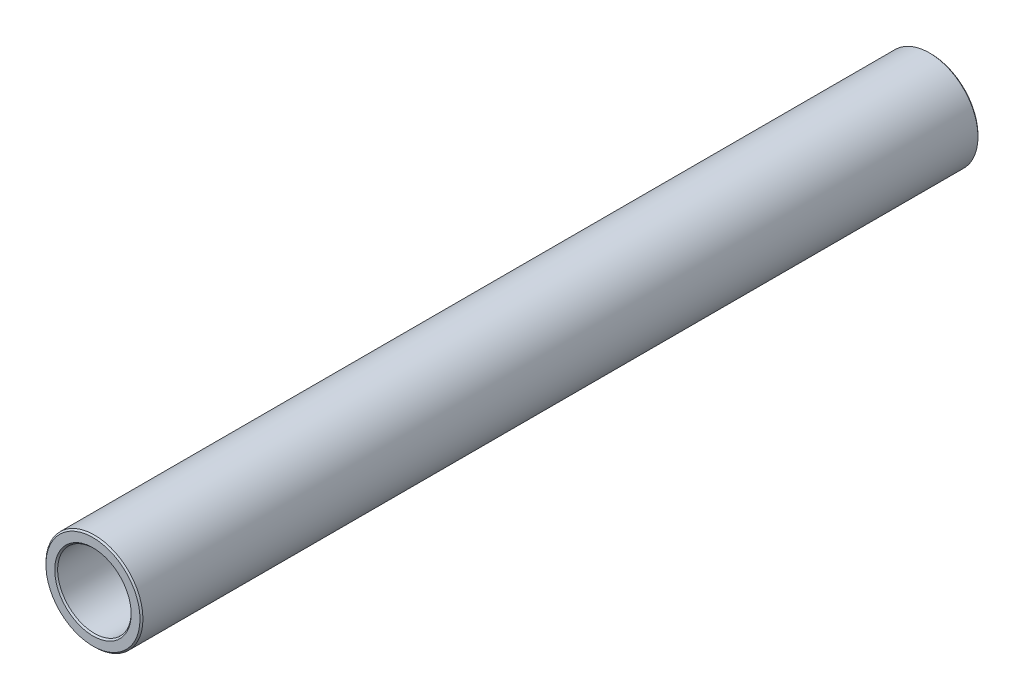
ISO-10303-21;
HEADER;
FILE_DESCRIPTION(('STEP AP214'),'2;1');
FILE_NAME('part.step','',(''),(''),'','','');
FILE_SCHEMA(('AUTOMOTIVE_DESIGN { 1 0 10303 214 1 1 1 1 }'));
ENDSEC;
DATA;
#1=APPLICATION_CONTEXT('core data for automotive mechanical design processes');
#2=APPLICATION_PROTOCOL_DEFINITION('international standard','automotive_design',2000,#1);
#3=PRODUCT_CONTEXT('',#1,'mechanical');
#4=PRODUCT('Part','Part','',(#3));
#5=PRODUCT_RELATED_PRODUCT_CATEGORY('part','',(#4));
#6=PRODUCT_DEFINITION_FORMATION('','',#4);
#7=PRODUCT_DEFINITION_CONTEXT('part definition',#1,'design');
#8=PRODUCT_DEFINITION('design','',#6,#7);
#9=PRODUCT_DEFINITION_SHAPE('','',#8);
#10=(LENGTH_UNIT() NAMED_UNIT(*) SI_UNIT(.MILLI.,.METRE.));
#11=(NAMED_UNIT(*) PLANE_ANGLE_UNIT() SI_UNIT($,.RADIAN.));
#12=(NAMED_UNIT(*) SI_UNIT($,.STERADIAN.) SOLID_ANGLE_UNIT());
#13=UNCERTAINTY_MEASURE_WITH_UNIT(LENGTH_MEASURE(1.E-05),#10,'distance_accuracy_value','');
#14=(GEOMETRIC_REPRESENTATION_CONTEXT(3) GLOBAL_UNCERTAINTY_ASSIGNED_CONTEXT((#13)) GLOBAL_UNIT_ASSIGNED_CONTEXT((#10,
#11,#12)) REPRESENTATION_CONTEXT('',''));
#15=CARTESIAN_POINT('',(0.,0.,0.));
#16=DIRECTION('',(0.,0.,1.));
#17=DIRECTION('',(1.,0.,0.));
#18=AXIS2_PLACEMENT_3D('',#15,#16,#17);
#19=CARTESIAN_POINT('',(0.,0.,285.));
#20=DIRECTION('',(0.,0.,1.));
#21=DIRECTION('',(1.,0.,0.));
#22=AXIS2_PLACEMENT_3D('',#19,#20,#21);
#23=PLANE('',#22);
#24=CARTESIAN_POINT('',(0.,0.,285.));
#25=DIRECTION('',(0.,0.,1.));
#26=DIRECTION('',(1.,0.,0.));
#27=AXIS2_PLACEMENT_3D('',#24,#25,#26);
#28=CIRCLE('',#27,26.);
#29=CARTESIAN_POINT('',(26.,0.,285.));
#30=VERTEX_POINT('',#29);
#31=EDGE_CURVE('E52',#30,#30,#28,.F.);
#32=ORIENTED_EDGE('',*,*,#31,.T.);
#33=EDGE_LOOP('',(#32));
#34=FACE_BOUND('',#33,.T.);
#35=CARTESIAN_POINT('',(0.,0.,285.));
#36=DIRECTION('',(0.,0.,1.));
#37=DIRECTION('',(1.,0.,0.));
#38=AXIS2_PLACEMENT_3D('',#35,#36,#37);
#39=CIRCLE('',#38,31.9999999999999);
#40=CARTESIAN_POINT('',(31.9999999999999,0.,285.));
#41=VERTEX_POINT('',#40);
#42=EDGE_CURVE('E55',#41,#41,#39,.T.);
#43=ORIENTED_EDGE('',*,*,#42,.T.);
#44=EDGE_LOOP('',(#43));
#45=FACE_BOUND('',#44,.T.);
#46=ADVANCED_FACE('F32',(#34,#45),#23,.T.);
#47=CARTESIAN_POINT('',(0.,0.,-285.));
#48=DIRECTION('',(0.,0.,1.));
#49=DIRECTION('',(1.,0.,0.));
#50=AXIS2_PLACEMENT_3D('',#47,#48,#49);
#51=PLANE('',#50);
#52=CARTESIAN_POINT('',(0.,0.,-285.));
#53=DIRECTION('',(0.,0.,1.));
#54=DIRECTION('',(1.,0.,0.));
#55=AXIS2_PLACEMENT_3D('',#52,#53,#54);
#56=CIRCLE('',#55,26.0000000000001);
#57=CARTESIAN_POINT('',(26.0000000000001,0.,-285.));
#58=VERTEX_POINT('',#57);
#59=EDGE_CURVE('E10',#58,#58,#56,.T.);
#60=ORIENTED_EDGE('',*,*,#59,.T.);
#61=EDGE_LOOP('',(#60));
#62=FACE_BOUND('',#61,.T.);
#63=CARTESIAN_POINT('',(0.,0.,-285.));
#64=DIRECTION('',(0.,0.,1.));
#65=DIRECTION('',(1.,0.,0.));
#66=AXIS2_PLACEMENT_3D('',#63,#64,#65);
#67=CIRCLE('',#66,32.);
#68=CARTESIAN_POINT('',(32.,0.,-285.));
#69=VERTEX_POINT('',#68);
#70=EDGE_CURVE('E39',#69,#69,#67,.F.);
#71=ORIENTED_EDGE('',*,*,#70,.T.);
#72=EDGE_LOOP('',(#71));
#73=FACE_BOUND('',#72,.T.);
#74=ADVANCED_FACE('F80',(#62,#73),#51,.F.);
#75=CARTESIAN_POINT('',(0.,0.,285.));
#76=DIRECTION('',(0.,0.,-1.));
#77=DIRECTION('',(-1.,0.,0.));
#78=AXIS2_PLACEMENT_3D('',#75,#76,#77);
#79=CYLINDRICAL_SURFACE('',#78,33.);
#80=CARTESIAN_POINT('',(0.,0.,284.));
#81=DIRECTION('',(0.,0.,1.));
#82=DIRECTION('',(1.,0.,0.));
#83=AXIS2_PLACEMENT_3D('',#80,#81,#82);
#84=CIRCLE('',#83,33.);
#85=CARTESIAN_POINT('',(33.,0.,284.));
#86=VERTEX_POINT('',#85);
#87=EDGE_CURVE('E43',#86,#86,#84,.F.);
#88=ORIENTED_EDGE('',*,*,#87,.T.);
#89=EDGE_LOOP('',(#88));
#90=FACE_BOUND('',#89,.T.);
#91=CARTESIAN_POINT('',(0.,0.,-284.));
#92=DIRECTION('',(0.,0.,1.));
#93=DIRECTION('',(1.,0.,0.));
#94=AXIS2_PLACEMENT_3D('',#91,#92,#93);
#95=CIRCLE('',#94,33.);
#96=CARTESIAN_POINT('',(33.,0.,-284.));
#97=VERTEX_POINT('',#96);
#98=EDGE_CURVE('E47',#97,#97,#95,.T.);
#99=ORIENTED_EDGE('',*,*,#98,.T.);
#100=EDGE_LOOP('',(#99));
#101=FACE_BOUND('',#100,.T.);
#102=ADVANCED_FACE('F86',(#90,#101),#79,.T.);
#103=CARTESIAN_POINT('',(0.,0.,285.));
#104=DIRECTION('',(0.,0.,-1.));
#105=DIRECTION('',(-1.,0.,0.));
#106=AXIS2_PLACEMENT_3D('',#103,#104,#105);
#107=CYLINDRICAL_SURFACE('',#106,25.);
#108=CARTESIAN_POINT('',(0.,0.,284.));
#109=DIRECTION('',(0.,0.,1.));
#110=DIRECTION('',(1.,0.,0.));
#111=AXIS2_PLACEMENT_3D('',#108,#109,#110);
#112=CIRCLE('',#111,25.);
#113=CARTESIAN_POINT('',(25.,0.,284.));
#114=VERTEX_POINT('',#113);
#115=EDGE_CURVE('E58',#114,#114,#112,.T.);
#116=ORIENTED_EDGE('',*,*,#115,.T.);
#117=EDGE_LOOP('',(#116));
#118=FACE_BOUND('',#117,.T.);
#119=CARTESIAN_POINT('',(0.,0.,-284.));
#120=DIRECTION('',(0.,0.,1.));
#121=DIRECTION('',(1.,0.,0.));
#122=AXIS2_PLACEMENT_3D('',#119,#120,#121);
#123=CIRCLE('',#122,25.);
#124=CARTESIAN_POINT('',(25.,0.,-284.));
#125=VERTEX_POINT('',#124);
#126=EDGE_CURVE('E61',#125,#125,#123,.F.);
#127=ORIENTED_EDGE('',*,*,#126,.T.);
#128=EDGE_LOOP('',(#127));
#129=FACE_BOUND('',#128,.T.);
#130=ADVANCED_FACE('F65',(#118,#129),#107,.F.);
#131=CARTESIAN_POINT('',(0.,0.,284.));
#132=DIRECTION('',(0.,0.,1.));
#133=DIRECTION('',(1.,0.,0.));
#134=AXIS2_PLACEMENT_3D('',#131,#132,#133);
#135=CONICAL_SURFACE('',#134,25.,0.785398163397459);
#136=ORIENTED_EDGE('',*,*,#31,.F.);
#137=EDGE_LOOP('',(#136));
#138=FACE_BOUND('',#137,.T.);
#139=ORIENTED_EDGE('',*,*,#115,.F.);
#140=EDGE_LOOP('',(#139));
#141=FACE_BOUND('',#140,.T.);
#142=ADVANCED_FACE('F76',(#138,#141),#135,.F.);
#143=CARTESIAN_POINT('',(0.,0.,285.));
#144=DIRECTION('',(0.,0.,-1.));
#145=DIRECTION('',(-1.,0.,0.));
#146=AXIS2_PLACEMENT_3D('',#143,#144,#145);
#147=CONICAL_SURFACE('',#146,31.9999999999999,0.785398163397462);
#148=ORIENTED_EDGE('',*,*,#87,.F.);
#149=EDGE_LOOP('',(#148));
#150=FACE_BOUND('',#149,.T.);
#151=ORIENTED_EDGE('',*,*,#42,.F.);
#152=EDGE_LOOP('',(#151));
#153=FACE_BOUND('',#152,.T.);
#154=ADVANCED_FACE('F70',(#150,#153),#147,.T.);
#155=CARTESIAN_POINT('',(0.,0.,-285.));
#156=DIRECTION('',(0.,0.,-1.));
#157=DIRECTION('',(-1.,0.,0.));
#158=AXIS2_PLACEMENT_3D('',#155,#156,#157);
#159=CONICAL_SURFACE('',#158,26.0000000000001,0.785398163397459);
#160=ORIENTED_EDGE('',*,*,#126,.F.);
#161=EDGE_LOOP('',(#160));
#162=FACE_BOUND('',#161,.T.);
#163=ORIENTED_EDGE('',*,*,#59,.F.);
#164=EDGE_LOOP('',(#163));
#165=FACE_BOUND('',#164,.T.);
#166=ADVANCED_FACE('F67',(#162,#165),#159,.F.);
#167=CARTESIAN_POINT('',(0.,0.,-284.));
#168=DIRECTION('',(0.,0.,1.));
#169=DIRECTION('',(1.,0.,0.));
#170=AXIS2_PLACEMENT_3D('',#167,#168,#169);
#171=CONICAL_SURFACE('',#170,33.,0.785398163397435);
#172=ORIENTED_EDGE('',*,*,#70,.F.);
#173=EDGE_LOOP('',(#172));
#174=FACE_BOUND('',#173,.T.);
#175=ORIENTED_EDGE('',*,*,#98,.F.);
#176=EDGE_LOOP('',(#175));
#177=FACE_BOUND('',#176,.T.);
#178=ADVANCED_FACE('F34',(#174,#177),#171,.T.);
#179=CLOSED_SHELL('',(#46,#74,#102,#130,#142,#154,#166,#178));
#180=MANIFOLD_SOLID_BREP('B2',#179);
#181=ADVANCED_BREP_SHAPE_REPRESENTATION('',(#18,#180),#14);
#182=SHAPE_DEFINITION_REPRESENTATION(#9,#181);
ENDSEC;
END-ISO-10303-21;
